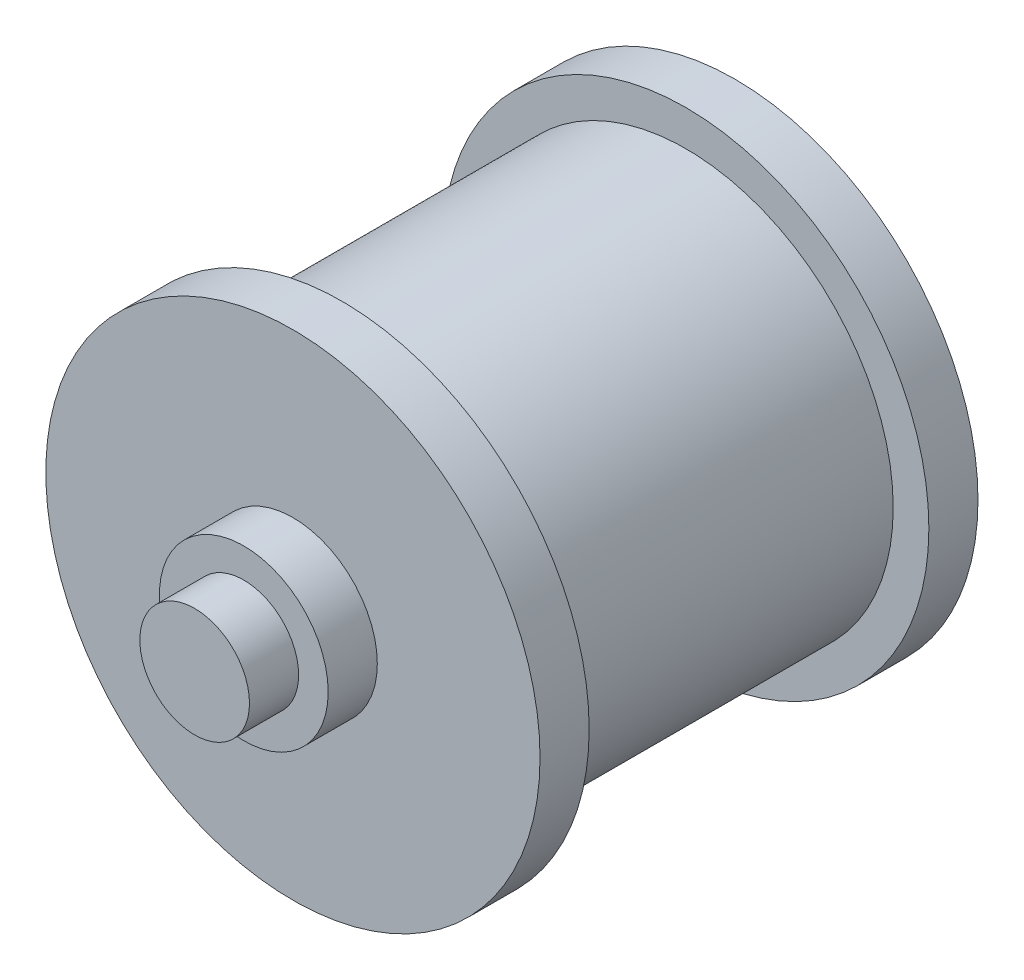
ISO-10303-21;
HEADER;
FILE_DESCRIPTION(('STEP AP214'),'2;1');
FILE_NAME('part.step','',(''),(''),'','','');
FILE_SCHEMA(('AUTOMOTIVE_DESIGN { 1 0 10303 214 1 1 1 1 }'));
ENDSEC;
DATA;
#1=APPLICATION_CONTEXT('core data for automotive mechanical design processes');
#2=APPLICATION_PROTOCOL_DEFINITION('international standard','automotive_design',2000,#1);
#3=PRODUCT_CONTEXT('',#1,'mechanical');
#4=PRODUCT('Part','Part','',(#3));
#5=PRODUCT_RELATED_PRODUCT_CATEGORY('part','',(#4));
#6=PRODUCT_DEFINITION_FORMATION('','',#4);
#7=PRODUCT_DEFINITION_CONTEXT('part definition',#1,'design');
#8=PRODUCT_DEFINITION('design','',#6,#7);
#9=PRODUCT_DEFINITION_SHAPE('','',#8);
#10=(LENGTH_UNIT() NAMED_UNIT(*) SI_UNIT(.MILLI.,.METRE.));
#11=(NAMED_UNIT(*) PLANE_ANGLE_UNIT() SI_UNIT($,.RADIAN.));
#12=(NAMED_UNIT(*) SI_UNIT($,.STERADIAN.) SOLID_ANGLE_UNIT());
#13=UNCERTAINTY_MEASURE_WITH_UNIT(LENGTH_MEASURE(1.E-05),#10,'distance_accuracy_value','');
#14=(GEOMETRIC_REPRESENTATION_CONTEXT(3) GLOBAL_UNCERTAINTY_ASSIGNED_CONTEXT((#13)) GLOBAL_UNIT_ASSIGNED_CONTEXT((#10,
#11,#12)) REPRESENTATION_CONTEXT('',''));
#15=CARTESIAN_POINT('',(0.,0.,0.));
#16=DIRECTION('',(0.,0.,1.));
#17=DIRECTION('',(1.,0.,0.));
#18=AXIS2_PLACEMENT_3D('',#15,#16,#17);
#19=CARTESIAN_POINT('',(0.,0.,23.1783026437438));
#20=DIRECTION('',(0.,0.,-1.));
#21=DIRECTION('',(-1.,0.,0.));
#22=AXIS2_PLACEMENT_3D('',#19,#20,#21);
#23=CYLINDRICAL_SURFACE('',#22,31.1498872920913);
#24=CARTESIAN_POINT('',(0.,0.,23.1783026437438));
#25=DIRECTION('',(0.,0.,1.));
#26=DIRECTION('',(1.,0.,0.));
#27=AXIS2_PLACEMENT_3D('',#24,#25,#26);
#28=CIRCLE('',#27,31.1498872920913);
#29=CARTESIAN_POINT('',(31.1498872920913,0.,23.1783026437438));
#30=VERTEX_POINT('',#29);
#31=EDGE_CURVE('E77',#30,#30,#28,.T.);
#32=ORIENTED_EDGE('',*,*,#31,.F.);
#33=EDGE_LOOP('',(#32));
#34=FACE_BOUND('',#33,.T.);
#35=CARTESIAN_POINT('',(0.,0.,16.8783026437438));
#36=DIRECTION('',(0.,0.,1.));
#37=DIRECTION('',(1.,0.,0.));
#38=AXIS2_PLACEMENT_3D('',#35,#36,#37);
#39=CIRCLE('',#38,31.1498872920913);
#40=CARTESIAN_POINT('',(31.1498872920913,0.,16.8783026437438));
#41=VERTEX_POINT('',#40);
#42=EDGE_CURVE('E38',#41,#41,#39,.T.);
#43=ORIENTED_EDGE('',*,*,#42,.T.);
#44=EDGE_LOOP('',(#43));
#45=FACE_BOUND('',#44,.T.);
#46=ADVANCED_FACE('F35',(#34,#45),#23,.T.);
#47=CARTESIAN_POINT('',(0.,0.,23.1783026437438));
#48=DIRECTION('',(0.,0.,1.));
#49=DIRECTION('',(1.,0.,0.));
#50=AXIS2_PLACEMENT_3D('',#47,#48,#49);
#51=PLANE('',#50);
#52=CARTESIAN_POINT('',(0.,0.,23.1783026437438));
#53=DIRECTION('',(0.,0.,1.));
#54=DIRECTION('',(1.,0.,0.));
#55=AXIS2_PLACEMENT_3D('',#52,#53,#54);
#56=CIRCLE('',#55,26.5774041878868);
#57=CARTESIAN_POINT('',(26.5774041878868,0.,23.1783026437438));
#58=VERTEX_POINT('',#57);
#59=EDGE_CURVE('E67',#58,#58,#56,.T.);
#60=ORIENTED_EDGE('',*,*,#59,.F.);
#61=EDGE_LOOP('',(#60));
#62=FACE_BOUND('',#61,.T.);
#63=ORIENTED_EDGE('',*,*,#31,.T.);
#64=EDGE_LOOP('',(#63));
#65=FACE_BOUND('',#64,.T.);
#66=ADVANCED_FACE('F88',(#62,#65),#51,.T.);
#67=CARTESIAN_POINT('',(0.,0.,16.8783026437438));
#68=DIRECTION('',(0.,0.,1.));
#69=DIRECTION('',(1.,0.,0.));
#70=AXIS2_PLACEMENT_3D('',#67,#68,#69);
#71=PLANE('',#70);
#72=CARTESIAN_POINT('',(0.,0.,16.8783026437438));
#73=DIRECTION('',(0.,0.,-1.));
#74=DIRECTION('',(-1.,0.,0.));
#75=AXIS2_PLACEMENT_3D('',#72,#73,#74);
#76=CIRCLE('',#75,8.62832199090482);
#77=CARTESIAN_POINT('',(-8.62832199090482,0.,16.8783026437438));
#78=VERTEX_POINT('',#77);
#79=EDGE_CURVE('E61',#78,#78,#76,.T.);
#80=ORIENTED_EDGE('',*,*,#79,.F.);
#81=EDGE_LOOP('',(#80));
#82=FACE_BOUND('',#81,.T.);
#83=ORIENTED_EDGE('',*,*,#42,.F.);
#84=EDGE_LOOP('',(#83));
#85=FACE_BOUND('',#84,.T.);
#86=ADVANCED_FACE('F85',(#82,#85),#71,.F.);
#87=CARTESIAN_POINT('',(0.,0.,67.2783026437438));
#88=DIRECTION('',(0.,0.,-1.));
#89=DIRECTION('',(-1.,0.,0.));
#90=AXIS2_PLACEMENT_3D('',#87,#88,#89);
#91=CYLINDRICAL_SURFACE('',#90,26.5774041878868);
#92=CARTESIAN_POINT('',(0.,0.,67.2783026437438));
#93=DIRECTION('',(0.,0.,1.));
#94=DIRECTION('',(1.,0.,0.));
#95=AXIS2_PLACEMENT_3D('',#92,#93,#94);
#96=CIRCLE('',#95,26.5774041878868);
#97=CARTESIAN_POINT('',(26.5774041878868,0.,67.2783026437438));
#98=VERTEX_POINT('',#97);
#99=EDGE_CURVE('E71',#98,#98,#96,.T.);
#100=ORIENTED_EDGE('',*,*,#99,.F.);
#101=EDGE_LOOP('',(#100));
#102=FACE_BOUND('',#101,.T.);
#103=ORIENTED_EDGE('',*,*,#59,.T.);
#104=EDGE_LOOP('',(#103));
#105=FACE_BOUND('',#104,.T.);
#106=ADVANCED_FACE('F87',(#102,#105),#91,.T.);
#107=CARTESIAN_POINT('',(0.,0.,73.5783026437438));
#108=DIRECTION('',(0.,0.,-1.));
#109=DIRECTION('',(-1.,0.,0.));
#110=AXIS2_PLACEMENT_3D('',#107,#108,#109);
#111=CYLINDRICAL_SURFACE('',#110,31.688665598706);
#112=CARTESIAN_POINT('',(0.,0.,73.5783026437438));
#113=DIRECTION('',(0.,0.,1.));
#114=DIRECTION('',(1.,0.,0.));
#115=AXIS2_PLACEMENT_3D('',#112,#113,#114);
#116=CIRCLE('',#115,31.688665598706);
#117=CARTESIAN_POINT('',(31.688665598706,0.,73.5783026437438));
#118=VERTEX_POINT('',#117);
#119=EDGE_CURVE('E68',#118,#118,#116,.T.);
#120=ORIENTED_EDGE('',*,*,#119,.F.);
#121=EDGE_LOOP('',(#120));
#122=FACE_BOUND('',#121,.T.);
#123=CARTESIAN_POINT('',(0.,0.,67.2783026437438));
#124=DIRECTION('',(0.,0.,1.));
#125=DIRECTION('',(1.,0.,0.));
#126=AXIS2_PLACEMENT_3D('',#123,#124,#125);
#127=CIRCLE('',#126,31.688665598706);
#128=CARTESIAN_POINT('',(31.688665598706,0.,67.2783026437438));
#129=VERTEX_POINT('',#128);
#130=EDGE_CURVE('E64',#129,#129,#127,.T.);
#131=ORIENTED_EDGE('',*,*,#130,.T.);
#132=EDGE_LOOP('',(#131));
#133=FACE_BOUND('',#132,.T.);
#134=ADVANCED_FACE('F94',(#122,#133),#111,.T.);
#135=CARTESIAN_POINT('',(0.,0.,73.5783026437438));
#136=DIRECTION('',(0.,0.,1.));
#137=DIRECTION('',(1.,0.,0.));
#138=AXIS2_PLACEMENT_3D('',#135,#136,#137);
#139=PLANE('',#138);
#140=CARTESIAN_POINT('',(0.,0.,73.5783026437438));
#141=DIRECTION('',(0.,0.,1.));
#142=DIRECTION('',(1.,0.,0.));
#143=AXIS2_PLACEMENT_3D('',#140,#141,#142);
#144=CIRCLE('',#143,10.8213425953636);
#145=CARTESIAN_POINT('',(10.8213425953636,0.,73.5783026437438));
#146=VERTEX_POINT('',#145);
#147=EDGE_CURVE('E42',#146,#146,#144,.T.);
#148=ORIENTED_EDGE('',*,*,#147,.F.);
#149=EDGE_LOOP('',(#148));
#150=FACE_BOUND('',#149,.T.);
#151=ORIENTED_EDGE('',*,*,#119,.T.);
#152=EDGE_LOOP('',(#151));
#153=FACE_BOUND('',#152,.T.);
#154=ADVANCED_FACE('F127',(#150,#153),#139,.T.);
#155=CARTESIAN_POINT('',(0.,0.,67.2783026437438));
#156=DIRECTION('',(0.,0.,1.));
#157=DIRECTION('',(1.,0.,0.));
#158=AXIS2_PLACEMENT_3D('',#155,#156,#157);
#159=PLANE('',#158);
#160=ORIENTED_EDGE('',*,*,#99,.T.);
#161=EDGE_LOOP('',(#160));
#162=FACE_BOUND('',#161,.T.);
#163=ORIENTED_EDGE('',*,*,#130,.F.);
#164=EDGE_LOOP('',(#163));
#165=FACE_BOUND('',#164,.T.);
#166=ADVANCED_FACE('F137',(#162,#165),#159,.F.);
#167=CARTESIAN_POINT('',(0.,0.,10.5783026437438));
#168=DIRECTION('',(0.,0.,1.));
#169=DIRECTION('',(1.,0.,0.));
#170=AXIS2_PLACEMENT_3D('',#167,#168,#169);
#171=CYLINDRICAL_SURFACE('',#170,8.62832199090482);
#172=CARTESIAN_POINT('',(0.,0.,10.5783026437438));
#173=DIRECTION('',(0.,0.,-1.));
#174=DIRECTION('',(-1.,0.,0.));
#175=AXIS2_PLACEMENT_3D('',#172,#173,#174);
#176=CIRCLE('',#175,8.62832199090482);
#177=CARTESIAN_POINT('',(-8.62832199090482,0.,10.5783026437438));
#178=VERTEX_POINT('',#177);
#179=EDGE_CURVE('E58',#178,#178,#176,.T.);
#180=ORIENTED_EDGE('',*,*,#179,.F.);
#181=EDGE_LOOP('',(#180));
#182=FACE_BOUND('',#181,.T.);
#183=ORIENTED_EDGE('',*,*,#79,.T.);
#184=EDGE_LOOP('',(#183));
#185=FACE_BOUND('',#184,.T.);
#186=ADVANCED_FACE('F147',(#182,#185),#171,.T.);
#187=CARTESIAN_POINT('',(0.,0.,10.5783026437438));
#188=DIRECTION('',(0.,0.,-1.));
#189=DIRECTION('',(-1.,0.,0.));
#190=AXIS2_PLACEMENT_3D('',#187,#188,#189);
#191=PLANE('',#190);
#192=CARTESIAN_POINT('',(0.,0.,10.5783026437438));
#193=DIRECTION('',(0.,0.,-1.));
#194=DIRECTION('',(-1.,0.,0.));
#195=AXIS2_PLACEMENT_3D('',#192,#193,#194);
#196=CIRCLE('',#195,5.79206060683531);
#197=CARTESIAN_POINT('',(-5.79206060683531,0.,10.5783026437438));
#198=VERTEX_POINT('',#197);
#199=EDGE_CURVE('E47',#198,#198,#196,.T.);
#200=ORIENTED_EDGE('',*,*,#199,.F.);
#201=EDGE_LOOP('',(#200));
#202=FACE_BOUND('',#201,.T.);
#203=ORIENTED_EDGE('',*,*,#179,.T.);
#204=EDGE_LOOP('',(#203));
#205=FACE_BOUND('',#204,.T.);
#206=ADVANCED_FACE('F157',(#202,#205),#191,.T.);
#207=CARTESIAN_POINT('',(0.,0.,4.2783026437438));
#208=DIRECTION('',(0.,0.,1.));
#209=DIRECTION('',(1.,0.,0.));
#210=AXIS2_PLACEMENT_3D('',#207,#208,#209);
#211=CYLINDRICAL_SURFACE('',#210,5.79206060683531);
#212=CARTESIAN_POINT('',(0.,0.,4.2783026437438));
#213=DIRECTION('',(0.,0.,-1.));
#214=DIRECTION('',(-1.,0.,0.));
#215=AXIS2_PLACEMENT_3D('',#212,#213,#214);
#216=CIRCLE('',#215,5.79206060683531);
#217=CARTESIAN_POINT('',(-5.79206060683531,0.,4.2783026437438));
#218=VERTEX_POINT('',#217);
#219=EDGE_CURVE('E54',#218,#218,#216,.T.);
#220=ORIENTED_EDGE('',*,*,#219,.F.);
#221=EDGE_LOOP('',(#220));
#222=FACE_BOUND('',#221,.T.);
#223=ORIENTED_EDGE('',*,*,#199,.T.);
#224=EDGE_LOOP('',(#223));
#225=FACE_BOUND('',#224,.T.);
#226=ADVANCED_FACE('F167',(#222,#225),#211,.T.);
#227=CARTESIAN_POINT('',(0.,0.,4.2783026437438));
#228=DIRECTION('',(0.,0.,-1.));
#229=DIRECTION('',(-1.,0.,0.));
#230=AXIS2_PLACEMENT_3D('',#227,#228,#229);
#231=PLANE('',#230);
#232=ORIENTED_EDGE('',*,*,#219,.T.);
#233=EDGE_LOOP('',(#232));
#234=FACE_BOUND('',#233,.T.);
#235=ADVANCED_FACE('F177',(#234),#231,.T.);
#236=CARTESIAN_POINT('',(0.,0.,79.8783026437438));
#237=DIRECTION('',(0.,0.,-1.));
#238=DIRECTION('',(-1.,0.,0.));
#239=AXIS2_PLACEMENT_3D('',#236,#237,#238);
#240=CYLINDRICAL_SURFACE('',#239,10.8213425953636);
#241=CARTESIAN_POINT('',(0.,0.,79.8783026437438));
#242=DIRECTION('',(0.,0.,1.));
#243=DIRECTION('',(1.,0.,0.));
#244=AXIS2_PLACEMENT_3D('',#241,#242,#243);
#245=CIRCLE('',#244,10.8213425953636);
#246=CARTESIAN_POINT('',(10.8213425953636,0.,79.8783026437438));
#247=VERTEX_POINT('',#246);
#248=EDGE_CURVE('E52',#247,#247,#245,.T.);
#249=ORIENTED_EDGE('',*,*,#248,.F.);
#250=EDGE_LOOP('',(#249));
#251=FACE_BOUND('',#250,.T.);
#252=ORIENTED_EDGE('',*,*,#147,.T.);
#253=EDGE_LOOP('',(#252));
#254=FACE_BOUND('',#253,.T.);
#255=ADVANCED_FACE('F187',(#251,#254),#240,.T.);
#256=CARTESIAN_POINT('',(0.,0.,79.8783026437438));
#257=DIRECTION('',(0.,0.,1.));
#258=DIRECTION('',(1.,0.,0.));
#259=AXIS2_PLACEMENT_3D('',#256,#257,#258);
#260=PLANE('',#259);
#261=CARTESIAN_POINT('',(0.,0.,79.8783026437438));
#262=DIRECTION('',(0.,0.,1.));
#263=DIRECTION('',(1.,0.,0.));
#264=AXIS2_PLACEMENT_3D('',#261,#262,#263);
#265=CIRCLE('',#264,7.02922179875028);
#266=CARTESIAN_POINT('',(7.02922179875028,0.,79.8783026437438));
#267=VERTEX_POINT('',#266);
#268=EDGE_CURVE('E10',#267,#267,#265,.T.);
#269=ORIENTED_EDGE('',*,*,#268,.F.);
#270=EDGE_LOOP('',(#269));
#271=FACE_BOUND('',#270,.T.);
#272=ORIENTED_EDGE('',*,*,#248,.T.);
#273=EDGE_LOOP('',(#272));
#274=FACE_BOUND('',#273,.T.);
#275=ADVANCED_FACE('F197',(#271,#274),#260,.T.);
#276=CARTESIAN_POINT('',(0.,0.,86.1783026437438));
#277=DIRECTION('',(0.,0.,-1.));
#278=DIRECTION('',(-1.,0.,0.));
#279=AXIS2_PLACEMENT_3D('',#276,#277,#278);
#280=CYLINDRICAL_SURFACE('',#279,7.02922179875028);
#281=CARTESIAN_POINT('',(0.,0.,86.1783026437438));
#282=DIRECTION('',(0.,0.,1.));
#283=DIRECTION('',(1.,0.,0.));
#284=AXIS2_PLACEMENT_3D('',#281,#282,#283);
#285=CIRCLE('',#284,7.02922179875028);
#286=CARTESIAN_POINT('',(7.02922179875028,0.,86.1783026437438));
#287=VERTEX_POINT('',#286);
#288=EDGE_CURVE('E51',#287,#287,#285,.T.);
#289=ORIENTED_EDGE('',*,*,#288,.F.);
#290=EDGE_LOOP('',(#289));
#291=FACE_BOUND('',#290,.T.);
#292=ORIENTED_EDGE('',*,*,#268,.T.);
#293=EDGE_LOOP('',(#292));
#294=FACE_BOUND('',#293,.T.);
#295=ADVANCED_FACE('F207',(#291,#294),#280,.T.);
#296=CARTESIAN_POINT('',(0.,0.,86.1783026437438));
#297=DIRECTION('',(0.,0.,1.));
#298=DIRECTION('',(1.,0.,0.));
#299=AXIS2_PLACEMENT_3D('',#296,#297,#298);
#300=PLANE('',#299);
#301=ORIENTED_EDGE('',*,*,#288,.T.);
#302=EDGE_LOOP('',(#301));
#303=FACE_BOUND('',#302,.T.);
#304=ADVANCED_FACE('F217',(#303),#300,.T.);
#305=CLOSED_SHELL('',(#46,#66,#86,#106,#134,#154,#166,#186,#206,#226,#235,#255,#275,#295,#304));
#306=MANIFOLD_SOLID_BREP('B2',#305);
#307=ADVANCED_BREP_SHAPE_REPRESENTATION('',(#18,#306),#14);
#308=SHAPE_DEFINITION_REPRESENTATION(#9,#307);
ENDSEC;
END-ISO-10303-21;
